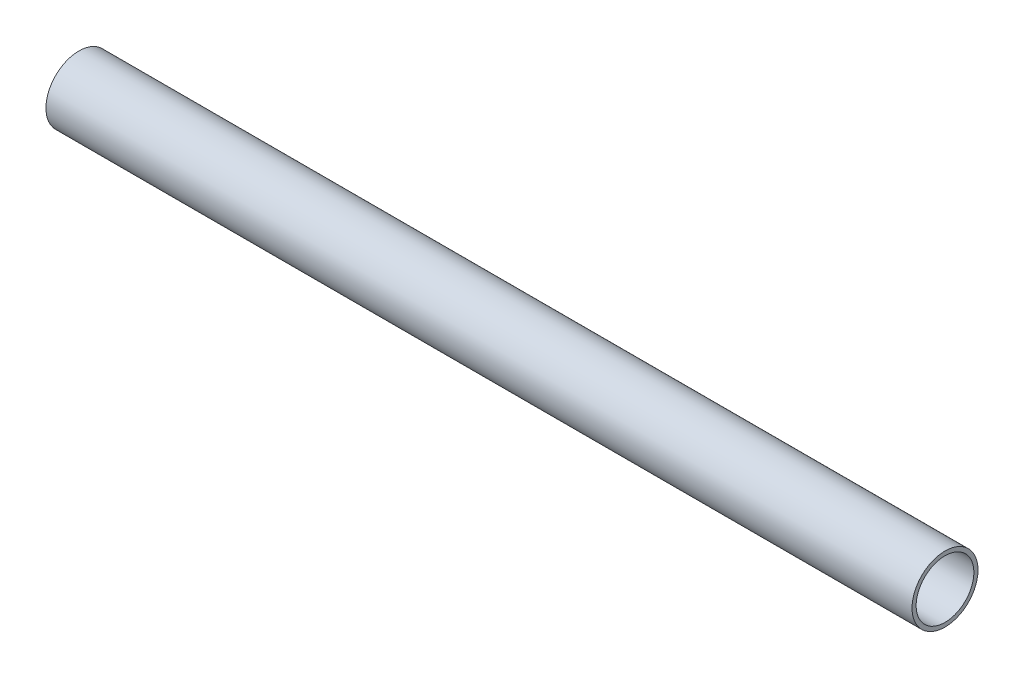
ISO-10303-21;
HEADER;
FILE_DESCRIPTION(('STEP AP214'),'2;1');
FILE_NAME('part.step','',(''),(''),'','','');
FILE_SCHEMA(('AUTOMOTIVE_DESIGN { 1 0 10303 214 1 1 1 1 }'));
ENDSEC;
DATA;
#1=APPLICATION_CONTEXT('core data for automotive mechanical design processes');
#2=APPLICATION_PROTOCOL_DEFINITION('international standard','automotive_design',2000,#1);
#3=PRODUCT_CONTEXT('',#1,'mechanical');
#4=PRODUCT('Part','Part','',(#3));
#5=PRODUCT_RELATED_PRODUCT_CATEGORY('part','',(#4));
#6=PRODUCT_DEFINITION_FORMATION('','',#4);
#7=PRODUCT_DEFINITION_CONTEXT('part definition',#1,'design');
#8=PRODUCT_DEFINITION('design','',#6,#7);
#9=PRODUCT_DEFINITION_SHAPE('','',#8);
#10=(LENGTH_UNIT() NAMED_UNIT(*) SI_UNIT(.MILLI.,.METRE.));
#11=(NAMED_UNIT(*) PLANE_ANGLE_UNIT() SI_UNIT($,.RADIAN.));
#12=(NAMED_UNIT(*) SI_UNIT($,.STERADIAN.) SOLID_ANGLE_UNIT());
#13=UNCERTAINTY_MEASURE_WITH_UNIT(LENGTH_MEASURE(1.E-05),#10,'distance_accuracy_value','');
#14=(GEOMETRIC_REPRESENTATION_CONTEXT(3) GLOBAL_UNCERTAINTY_ASSIGNED_CONTEXT((#13)) GLOBAL_UNIT_ASSIGNED_CONTEXT((#10,
#11,#12)) REPRESENTATION_CONTEXT('',''));
#15=CARTESIAN_POINT('',(0.,0.,0.));
#16=DIRECTION('',(0.,0.,1.));
#17=DIRECTION('',(1.,0.,0.));
#18=AXIS2_PLACEMENT_3D('',#15,#16,#17);
#19=CARTESIAN_POINT('',(210.,0.,0.));
#20=DIRECTION('',(1.,0.,0.));
#21=DIRECTION('',(0.,0.,-1.));
#22=AXIS2_PLACEMENT_3D('',#19,#20,#21);
#23=PLANE('',#22);
#24=CARTESIAN_POINT('',(210.,0.,0.));
#25=DIRECTION('',(1.,0.,0.));
#26=DIRECTION('',(0.,0.,-1.));
#27=AXIS2_PLACEMENT_3D('',#24,#25,#26);
#28=CIRCLE('',#27,8.);
#29=CARTESIAN_POINT('',(210.,0.,-8.));
#30=VERTEX_POINT('',#29);
#31=EDGE_CURVE('E10',#30,#30,#28,.T.);
#32=ORIENTED_EDGE('',*,*,#31,.T.);
#33=EDGE_LOOP('',(#32));
#34=FACE_BOUND('',#33,.T.);
#35=CARTESIAN_POINT('',(210.,0.,0.));
#36=DIRECTION('',(1.,0.,0.));
#37=DIRECTION('',(0.,0.,-1.));
#38=AXIS2_PLACEMENT_3D('',#35,#36,#37);
#39=CIRCLE('',#38,7.);
#40=CARTESIAN_POINT('',(210.,0.,-7.));
#41=VERTEX_POINT('',#40);
#42=EDGE_CURVE('E48',#41,#41,#39,.T.);
#43=ORIENTED_EDGE('',*,*,#42,.F.);
#44=EDGE_LOOP('',(#43));
#45=FACE_BOUND('',#44,.T.);
#46=ADVANCED_FACE('F35',(#34,#45),#23,.T.);
#47=CARTESIAN_POINT('',(0.,0.,0.));
#48=DIRECTION('',(1.,0.,0.));
#49=DIRECTION('',(0.,0.,-1.));
#50=AXIS2_PLACEMENT_3D('',#47,#48,#49);
#51=PLANE('',#50);
#52=CARTESIAN_POINT('',(0.,0.,0.));
#53=DIRECTION('',(1.,0.,0.));
#54=DIRECTION('',(0.,0.,-1.));
#55=AXIS2_PLACEMENT_3D('',#52,#53,#54);
#56=CIRCLE('',#55,8.);
#57=CARTESIAN_POINT('',(0.,0.,-8.));
#58=VERTEX_POINT('',#57);
#59=EDGE_CURVE('E39',#58,#58,#56,.T.);
#60=ORIENTED_EDGE('',*,*,#59,.F.);
#61=EDGE_LOOP('',(#60));
#62=FACE_BOUND('',#61,.T.);
#63=CARTESIAN_POINT('',(0.,0.,0.));
#64=DIRECTION('',(1.,0.,0.));
#65=DIRECTION('',(0.,0.,-1.));
#66=AXIS2_PLACEMENT_3D('',#63,#64,#65);
#67=CIRCLE('',#66,7.);
#68=CARTESIAN_POINT('',(0.,0.,-7.));
#69=VERTEX_POINT('',#68);
#70=EDGE_CURVE('E50',#69,#69,#67,.T.);
#71=ORIENTED_EDGE('',*,*,#70,.T.);
#72=EDGE_LOOP('',(#71));
#73=FACE_BOUND('',#72,.T.);
#74=ADVANCED_FACE('F62',(#62,#73),#51,.F.);
#75=CARTESIAN_POINT('',(210.,0.,0.));
#76=DIRECTION('',(-1.,0.,0.));
#77=DIRECTION('',(0.,0.,1.));
#78=AXIS2_PLACEMENT_3D('',#75,#76,#77);
#79=CYLINDRICAL_SURFACE('',#78,8.);
#80=ORIENTED_EDGE('',*,*,#31,.F.);
#81=EDGE_LOOP('',(#80));
#82=FACE_BOUND('',#81,.T.);
#83=ORIENTED_EDGE('',*,*,#59,.T.);
#84=EDGE_LOOP('',(#83));
#85=FACE_BOUND('',#84,.T.);
#86=ADVANCED_FACE('F37',(#82,#85),#79,.T.);
#87=CARTESIAN_POINT('',(210.,0.,0.));
#88=DIRECTION('',(-1.,0.,0.));
#89=DIRECTION('',(0.,0.,1.));
#90=AXIS2_PLACEMENT_3D('',#87,#88,#89);
#91=CYLINDRICAL_SURFACE('',#90,7.);
#92=ORIENTED_EDGE('',*,*,#42,.T.);
#93=EDGE_LOOP('',(#92));
#94=FACE_BOUND('',#93,.T.);
#95=ORIENTED_EDGE('',*,*,#70,.F.);
#96=EDGE_LOOP('',(#95));
#97=FACE_BOUND('',#96,.T.);
#98=ADVANCED_FACE('F58',(#94,#97),#91,.F.);
#99=CLOSED_SHELL('',(#46,#74,#86,#98));
#100=MANIFOLD_SOLID_BREP('B2',#99);
#101=ADVANCED_BREP_SHAPE_REPRESENTATION('',(#18,#100),#14);
#102=SHAPE_DEFINITION_REPRESENTATION(#9,#101);
ENDSEC;
END-ISO-10303-21;
